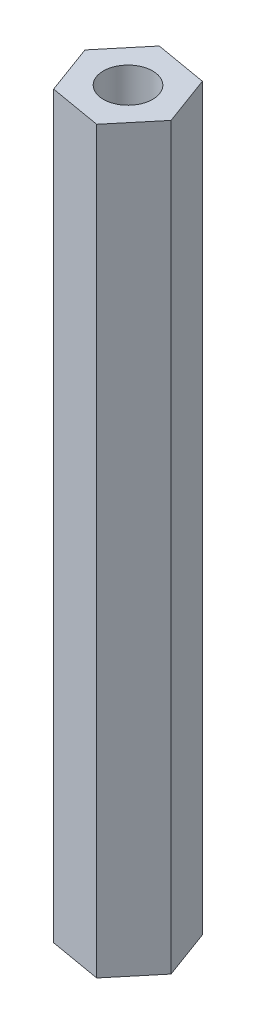
ISO-10303-21;
HEADER;
FILE_DESCRIPTION(('STEP AP214'),'2;1');
FILE_NAME('part.step','',(''),(''),'','','');
FILE_SCHEMA(('AUTOMOTIVE_DESIGN { 1 0 10303 214 1 1 1 1 }'));
ENDSEC;
DATA;
#1=APPLICATION_CONTEXT('core data for automotive mechanical design processes');
#2=APPLICATION_PROTOCOL_DEFINITION('international standard','automotive_design',2000,#1);
#3=PRODUCT_CONTEXT('',#1,'mechanical');
#4=PRODUCT('Part','Part','',(#3));
#5=PRODUCT_RELATED_PRODUCT_CATEGORY('part','',(#4));
#6=PRODUCT_DEFINITION_FORMATION('','',#4);
#7=PRODUCT_DEFINITION_CONTEXT('part definition',#1,'design');
#8=PRODUCT_DEFINITION('design','',#6,#7);
#9=PRODUCT_DEFINITION_SHAPE('','',#8);
#10=(LENGTH_UNIT() NAMED_UNIT(*) SI_UNIT(.MILLI.,.METRE.));
#11=(NAMED_UNIT(*) PLANE_ANGLE_UNIT() SI_UNIT($,.RADIAN.));
#12=(NAMED_UNIT(*) SI_UNIT($,.STERADIAN.) SOLID_ANGLE_UNIT());
#13=UNCERTAINTY_MEASURE_WITH_UNIT(LENGTH_MEASURE(1.E-05),#10,'distance_accuracy_value','');
#14=(GEOMETRIC_REPRESENTATION_CONTEXT(3) GLOBAL_UNCERTAINTY_ASSIGNED_CONTEXT((#13)) GLOBAL_UNIT_ASSIGNED_CONTEXT((#10,
#11,#12)) REPRESENTATION_CONTEXT('',''));
#15=CARTESIAN_POINT('',(0.,0.,0.));
#16=DIRECTION('',(0.,0.,1.));
#17=DIRECTION('',(1.,0.,0.));
#18=AXIS2_PLACEMENT_3D('',#15,#16,#17);
#19=CARTESIAN_POINT('',(0.,45.,0.));
#20=DIRECTION('',(0.,1.,0.));
#21=DIRECTION('',(0.,0.,1.));
#22=AXIS2_PLACEMENT_3D('',#19,#20,#21);
#23=PLANE('',#22);
#24=DIRECTION('',(0.985494120976988,0.,0.169709568144505));
#25=VECTOR('',#24,1.);
#26=CARTESIAN_POINT('',(-2.05624239989983,45.,2.47052622846547));
#27=LINE('',#26,#25);
#28=CARTESIAN_POINT('',(-2.05624239989983,45.,2.47052622846547));
#29=VERTEX_POINT('',#28);
#30=CARTESIAN_POINT('',(1.11141727466937,45.,3.01602126893));
#31=VERTEX_POINT('',#30);
#32=EDGE_CURVE('E146',#29,#31,#27,.T.);
#33=ORIENTED_EDGE('',*,*,#32,.T.);
#34=DIRECTION('',(0.639719857783097,0.,-0.768608159960571));
#35=VECTOR('',#34,1.);
#36=CARTESIAN_POINT('',(1.11141727466937,45.,3.01602126893));
#37=LINE('',#36,#35);
#38=CARTESIAN_POINT('',(3.16765967459966,45.,0.545495040589612));
#39=VERTEX_POINT('',#38);
#40=EDGE_CURVE('E94',#31,#39,#37,.T.);
#41=ORIENTED_EDGE('',*,*,#40,.T.);
#42=DIRECTION('',(-0.345774263225589,0.,-0.938317728112818));
#43=VECTOR('',#42,1.);
#44=CARTESIAN_POINT('',(3.16765967459966,45.,0.545495040589612));
#45=LINE('',#44,#43);
#46=CARTESIAN_POINT('',(2.05624239989944,45.,-2.47052622847075));
#47=VERTEX_POINT('',#46);
#48=EDGE_CURVE('E107',#39,#47,#45,.T.);
#49=ORIENTED_EDGE('',*,*,#48,.T.);
#50=DIRECTION('',(-0.985494120976988,0.,-0.169709568144504));
#51=VECTOR('',#50,1.);
#52=CARTESIAN_POINT('',(2.05624239989944,45.,-2.47052622847075));
#53=LINE('',#52,#51);
#54=CARTESIAN_POINT('',(-1.11141727460843,45.,-3.01602126892472));
#55=VERTEX_POINT('',#54);
#56=EDGE_CURVE('E101',#47,#55,#53,.T.);
#57=ORIENTED_EDGE('',*,*,#56,.T.);
#58=DIRECTION('',(-0.639719857776031,0.,0.768608159966451));
#59=VECTOR('',#58,1.);
#60=CARTESIAN_POINT('',(-1.11141727460843,45.,-3.01602126892472));
#61=LINE('',#60,#59);
#62=CARTESIAN_POINT('',(-3.16765967459978,45.,-0.545495040464771));
#63=VERTEX_POINT('',#62);
#64=EDGE_CURVE('E105',#55,#63,#61,.T.);
#65=ORIENTED_EDGE('',*,*,#64,.T.);
#66=DIRECTION('',(0.345774263238647,0.,0.938317728108007));
#67=VECTOR('',#66,1.);
#68=CARTESIAN_POINT('',(-3.16765967459978,45.,-0.545495040464771));
#69=LINE('',#68,#67);
#70=EDGE_CURVE('E57',#63,#29,#69,.T.);
#71=ORIENTED_EDGE('',*,*,#70,.T.);
#72=EDGE_LOOP('',(#33,#41,#49,#57,#65,#71));
#73=FACE_BOUND('',#72,.T.);
#74=CARTESIAN_POINT('',(-3.16413562017876E-11,45.,-2.37904933848027E-13));
#75=DIRECTION('',(0.,1.,0.));
#76=DIRECTION('',(0.,0.,1.));
#77=AXIS2_PLACEMENT_3D('',#74,#75,#76);
#78=CIRCLE('',#77,1.5);
#79=CARTESIAN_POINT('',(-3.16413562017876E-11,45.,-1.50000000000024));
#80=VERTEX_POINT('',#79);
#81=EDGE_CURVE('E134',#80,#80,#78,.T.);
#82=ORIENTED_EDGE('',*,*,#81,.F.);
#83=EDGE_LOOP('',(#82));
#84=FACE_BOUND('',#83,.T.);
#85=ADVANCED_FACE('F39',(#73,#84),#23,.T.);
#86=CARTESIAN_POINT('',(0.,0.,0.));
#87=DIRECTION('',(0.,1.,0.));
#88=DIRECTION('',(0.,0.,1.));
#89=AXIS2_PLACEMENT_3D('',#86,#87,#88);
#90=PLANE('',#89);
#91=DIRECTION('',(0.985494120976988,0.,0.169709568144505));
#92=VECTOR('',#91,1.);
#93=CARTESIAN_POINT('',(-2.05624239989983,0.,2.47052622846547));
#94=LINE('',#93,#92);
#95=CARTESIAN_POINT('',(-2.05624239989983,0.,2.47052622846547));
#96=VERTEX_POINT('',#95);
#97=CARTESIAN_POINT('',(1.11141727466937,0.,3.01602126893));
#98=VERTEX_POINT('',#97);
#99=EDGE_CURVE('E129',#96,#98,#94,.T.);
#100=ORIENTED_EDGE('',*,*,#99,.F.);
#101=DIRECTION('',(0.345774263238647,0.,0.938317728108007));
#102=VECTOR('',#101,1.);
#103=CARTESIAN_POINT('',(-3.16765967459978,0.,-0.545495040464771));
#104=LINE('',#103,#102);
#105=CARTESIAN_POINT('',(-3.16765967459978,0.,-0.545495040464771));
#106=VERTEX_POINT('',#105);
#107=EDGE_CURVE('E86',#106,#96,#104,.T.);
#108=ORIENTED_EDGE('',*,*,#107,.F.);
#109=DIRECTION('',(-0.639719857776031,0.,0.768608159966451));
#110=VECTOR('',#109,1.);
#111=CARTESIAN_POINT('',(-1.11141727460843,0.,-3.01602126892472));
#112=LINE('',#111,#110);
#113=CARTESIAN_POINT('',(-1.11141727460843,0.,-3.01602126892472));
#114=VERTEX_POINT('',#113);
#115=EDGE_CURVE('E80',#114,#106,#112,.T.);
#116=ORIENTED_EDGE('',*,*,#115,.F.);
#117=DIRECTION('',(-0.985494120976988,0.,-0.169709568144504));
#118=VECTOR('',#117,1.);
#119=CARTESIAN_POINT('',(2.05624239989944,0.,-2.47052622847075));
#120=LINE('',#119,#118);
#121=CARTESIAN_POINT('',(2.05624239989944,0.,-2.47052622847075));
#122=VERTEX_POINT('',#121);
#123=EDGE_CURVE('E116',#122,#114,#120,.T.);
#124=ORIENTED_EDGE('',*,*,#123,.F.);
#125=DIRECTION('',(-0.345774263225589,0.,-0.938317728112818));
#126=VECTOR('',#125,1.);
#127=CARTESIAN_POINT('',(3.16765967459966,0.,0.545495040589612));
#128=LINE('',#127,#126);
#129=CARTESIAN_POINT('',(3.16765967459966,0.,0.545495040589612));
#130=VERTEX_POINT('',#129);
#131=EDGE_CURVE('E137',#130,#122,#128,.T.);
#132=ORIENTED_EDGE('',*,*,#131,.F.);
#133=DIRECTION('',(0.639719857783097,0.,-0.768608159960571));
#134=VECTOR('',#133,1.);
#135=CARTESIAN_POINT('',(1.11141727466937,0.,3.01602126893));
#136=LINE('',#135,#134);
#137=EDGE_CURVE('E133',#98,#130,#136,.T.);
#138=ORIENTED_EDGE('',*,*,#137,.F.);
#139=EDGE_LOOP('',(#100,#108,#116,#124,#132,#138));
#140=FACE_BOUND('',#139,.T.);
#141=CARTESIAN_POINT('',(-3.16413562017876E-11,0.,-2.37904933848027E-13));
#142=DIRECTION('',(0.,1.,0.));
#143=DIRECTION('',(0.,0.,1.));
#144=AXIS2_PLACEMENT_3D('',#141,#142,#143);
#145=CIRCLE('',#144,1.5);
#146=CARTESIAN_POINT('',(-3.16413562017876E-11,0.,-1.50000000000024));
#147=VERTEX_POINT('',#146);
#148=EDGE_CURVE('E243',#147,#147,#145,.T.);
#149=ORIENTED_EDGE('',*,*,#148,.T.);
#150=EDGE_LOOP('',(#149));
#151=FACE_BOUND('',#150,.T.);
#152=ADVANCED_FACE('F159',(#140,#151),#90,.F.);
#153=CARTESIAN_POINT('',(-2.05624239989983,45.,2.47052622846547));
#154=DIRECTION('',(0.169709568144505,0.,-0.985494120976988));
#155=DIRECTION('',(-0.985494120976988,0.,-0.169709568144505));
#156=AXIS2_PLACEMENT_3D('',#153,#154,#155);
#157=PLANE('',#156);
#158=ORIENTED_EDGE('',*,*,#99,.T.);
#159=DIRECTION('',(0.,-1.,0.));
#160=VECTOR('',#159,1.);
#161=CARTESIAN_POINT('',(1.11141727466937,45.,3.01602126893));
#162=LINE('',#161,#160);
#163=EDGE_CURVE('E11',#31,#98,#162,.T.);
#164=ORIENTED_EDGE('',*,*,#163,.F.);
#165=ORIENTED_EDGE('',*,*,#32,.F.);
#166=DIRECTION('',(0.,-1.,0.));
#167=VECTOR('',#166,1.);
#168=CARTESIAN_POINT('',(-2.05624239989983,45.,2.47052622846547));
#169=LINE('',#168,#167);
#170=EDGE_CURVE('E125',#29,#96,#169,.T.);
#171=ORIENTED_EDGE('',*,*,#170,.T.);
#172=EDGE_LOOP('',(#158,#164,#165,#171));
#173=FACE_BOUND('',#172,.T.);
#174=ADVANCED_FACE('F41',(#173),#157,.F.);
#175=CARTESIAN_POINT('',(1.11141727466937,45.,3.01602126893));
#176=DIRECTION('',(-0.768608159960571,0.,-0.639719857783097));
#177=DIRECTION('',(-0.639719857783097,0.,0.768608159960571));
#178=AXIS2_PLACEMENT_3D('',#175,#176,#177);
#179=PLANE('',#178);
#180=ORIENTED_EDGE('',*,*,#137,.T.);
#181=DIRECTION('',(0.,-1.,0.));
#182=VECTOR('',#181,1.);
#183=CARTESIAN_POINT('',(3.16765967459966,45.,0.545495040589612));
#184=LINE('',#183,#182);
#185=EDGE_CURVE('E49',#39,#130,#184,.T.);
#186=ORIENTED_EDGE('',*,*,#185,.F.);
#187=ORIENTED_EDGE('',*,*,#40,.F.);
#188=ORIENTED_EDGE('',*,*,#163,.T.);
#189=EDGE_LOOP('',(#180,#186,#187,#188));
#190=FACE_BOUND('',#189,.T.);
#191=ADVANCED_FACE('F184',(#190),#179,.F.);
#192=CARTESIAN_POINT('',(3.16765967459966,45.,0.545495040589612));
#193=DIRECTION('',(-0.938317728112818,0.,0.345774263225589));
#194=DIRECTION('',(0.345774263225589,0.,0.938317728112819));
#195=AXIS2_PLACEMENT_3D('',#192,#193,#194);
#196=PLANE('',#195);
#197=ORIENTED_EDGE('',*,*,#131,.T.);
#198=DIRECTION('',(0.,-1.,0.));
#199=VECTOR('',#198,1.);
#200=CARTESIAN_POINT('',(2.05624239989944,45.,-2.47052622847075));
#201=LINE('',#200,#199);
#202=EDGE_CURVE('E118',#47,#122,#201,.T.);
#203=ORIENTED_EDGE('',*,*,#202,.F.);
#204=ORIENTED_EDGE('',*,*,#48,.F.);
#205=ORIENTED_EDGE('',*,*,#185,.T.);
#206=EDGE_LOOP('',(#197,#203,#204,#205));
#207=FACE_BOUND('',#206,.T.);
#208=ADVANCED_FACE('F156',(#207),#196,.F.);
#209=CARTESIAN_POINT('',(2.05624239989944,45.,-2.47052622847075));
#210=DIRECTION('',(-0.169709568144504,0.,0.985494120976988));
#211=DIRECTION('',(0.985494120976988,0.,0.169709568144504));
#212=AXIS2_PLACEMENT_3D('',#209,#210,#211);
#213=PLANE('',#212);
#214=ORIENTED_EDGE('',*,*,#123,.T.);
#215=DIRECTION('',(0.,-1.,0.));
#216=VECTOR('',#215,1.);
#217=CARTESIAN_POINT('',(-1.11141727460843,45.,-3.01602126892472));
#218=LINE('',#217,#216);
#219=EDGE_CURVE('E113',#55,#114,#218,.T.);
#220=ORIENTED_EDGE('',*,*,#219,.F.);
#221=ORIENTED_EDGE('',*,*,#56,.F.);
#222=ORIENTED_EDGE('',*,*,#202,.T.);
#223=EDGE_LOOP('',(#214,#220,#221,#222));
#224=FACE_BOUND('',#223,.T.);
#225=ADVANCED_FACE('F114',(#224),#213,.F.);
#226=CARTESIAN_POINT('',(-1.11141727460843,45.,-3.01602126892472));
#227=DIRECTION('',(0.768608159966451,0.,0.639719857776031));
#228=DIRECTION('',(0.639719857776031,0.,-0.768608159966452));
#229=AXIS2_PLACEMENT_3D('',#226,#227,#228);
#230=PLANE('',#229);
#231=ORIENTED_EDGE('',*,*,#115,.T.);
#232=DIRECTION('',(0.,-1.,0.));
#233=VECTOR('',#232,1.);
#234=CARTESIAN_POINT('',(-3.16765967459978,45.,-0.545495040464771));
#235=LINE('',#234,#233);
#236=EDGE_CURVE('E119',#63,#106,#235,.T.);
#237=ORIENTED_EDGE('',*,*,#236,.F.);
#238=ORIENTED_EDGE('',*,*,#64,.F.);
#239=ORIENTED_EDGE('',*,*,#219,.T.);
#240=EDGE_LOOP('',(#231,#237,#238,#239));
#241=FACE_BOUND('',#240,.T.);
#242=ADVANCED_FACE('F121',(#241),#230,.F.);
#243=CARTESIAN_POINT('',(-3.16765967459978,45.,-0.545495040464771));
#244=DIRECTION('',(0.938317728108007,0.,-0.345774263238647));
#245=DIRECTION('',(-0.345774263238647,0.,-0.938317728108007));
#246=AXIS2_PLACEMENT_3D('',#243,#244,#245);
#247=PLANE('',#246);
#248=ORIENTED_EDGE('',*,*,#107,.T.);
#249=ORIENTED_EDGE('',*,*,#170,.F.);
#250=ORIENTED_EDGE('',*,*,#70,.F.);
#251=ORIENTED_EDGE('',*,*,#236,.T.);
#252=EDGE_LOOP('',(#248,#249,#250,#251));
#253=FACE_BOUND('',#252,.T.);
#254=ADVANCED_FACE('F164',(#253),#247,.F.);
#255=CARTESIAN_POINT('',(-3.16413562017876E-11,45.,-2.37904933848027E-13));
#256=DIRECTION('',(0.,-1.,0.));
#257=DIRECTION('',(0.,0.,-1.));
#258=AXIS2_PLACEMENT_3D('',#255,#256,#257);
#259=CYLINDRICAL_SURFACE('',#258,1.5);
#260=CARTESIAN_POINT('',(-3.16413562017876E-11,45.,-1.50000000000024));
#261=CARTESIAN_POINT('',(-3.16413562017876E-11,44.53125,-1.50000000000024));
#262=CARTESIAN_POINT('',(-3.16413562017876E-11,44.0625,-1.50000000000024));
#263=CARTESIAN_POINT('',(-3.16413562017876E-11,43.125,-1.50000000000024));
#264=CARTESIAN_POINT('',(-3.16413562017876E-11,42.65625,-1.50000000000024));
#265=CARTESIAN_POINT('',(-3.16413562017876E-11,41.71875,-1.50000000000024));
#266=CARTESIAN_POINT('',(-3.16413562017876E-11,41.25,-1.50000000000024));
#267=CARTESIAN_POINT('',(-3.16413562017876E-11,40.3125,-1.50000000000024));
#268=CARTESIAN_POINT('',(-3.16413562017876E-11,39.84375,-1.50000000000024));
#269=CARTESIAN_POINT('',(-3.16413562017876E-11,38.90625,-1.50000000000024));
#270=CARTESIAN_POINT('',(-3.16413562017876E-11,38.4375,-1.50000000000024));
#271=CARTESIAN_POINT('',(-3.16413562017876E-11,37.5,-1.50000000000024));
#272=CARTESIAN_POINT('',(-3.16413562017876E-11,37.03125,-1.50000000000024));
#273=CARTESIAN_POINT('',(-3.16413562017876E-11,36.09375,-1.50000000000024));
#274=CARTESIAN_POINT('',(-3.16413562017876E-11,35.625,-1.50000000000024));
#275=CARTESIAN_POINT('',(-3.16413562017876E-11,34.6875,-1.50000000000024));
#276=CARTESIAN_POINT('',(-3.16413562017876E-11,34.21875,-1.50000000000024));
#277=CARTESIAN_POINT('',(-3.16413562017876E-11,33.28125,-1.50000000000024));
#278=CARTESIAN_POINT('',(-3.16413562017876E-11,32.8125,-1.50000000000024));
#279=CARTESIAN_POINT('',(-3.16413562017876E-11,31.875,-1.50000000000024));
#280=CARTESIAN_POINT('',(-3.16413562017876E-11,31.40625,-1.50000000000024));
#281=CARTESIAN_POINT('',(-3.16413562017876E-11,30.46875,-1.50000000000024));
#282=CARTESIAN_POINT('',(-3.16413562017876E-11,30.,-1.50000000000024));
#283=CARTESIAN_POINT('',(-3.16413562017876E-11,29.0625,-1.50000000000024));
#284=CARTESIAN_POINT('',(-3.16413562017876E-11,28.59375,-1.50000000000024));
#285=CARTESIAN_POINT('',(-3.16413562017876E-11,27.65625,-1.50000000000024));
#286=CARTESIAN_POINT('',(-3.16413562017876E-11,27.1875,-1.50000000000024));
#287=CARTESIAN_POINT('',(-3.16413562017876E-11,26.25,-1.50000000000024));
#288=CARTESIAN_POINT('',(-3.16413562017876E-11,25.78125,-1.50000000000024));
#289=CARTESIAN_POINT('',(-3.16413562017876E-11,24.84375,-1.50000000000024));
#290=CARTESIAN_POINT('',(-3.16413562017876E-11,24.375,-1.50000000000024));
#291=CARTESIAN_POINT('',(-3.16413562017876E-11,23.4375,-1.50000000000024));
#292=CARTESIAN_POINT('',(-3.16413562017876E-11,22.96875,-1.50000000000024));
#293=CARTESIAN_POINT('',(-3.16413562017876E-11,22.03125,-1.50000000000024));
#294=CARTESIAN_POINT('',(-3.16413562017876E-11,21.5625,-1.50000000000024));
#295=CARTESIAN_POINT('',(-3.16413562017876E-11,20.625,-1.50000000000024));
#296=CARTESIAN_POINT('',(-3.16413562017876E-11,20.15625,-1.50000000000024));
#297=CARTESIAN_POINT('',(-3.16413562017876E-11,19.21875,-1.50000000000024));
#298=CARTESIAN_POINT('',(-3.16413562017876E-11,18.75,-1.50000000000024));
#299=CARTESIAN_POINT('',(-3.16413562017876E-11,17.8125,-1.50000000000024));
#300=CARTESIAN_POINT('',(-3.16413562017876E-11,17.34375,-1.50000000000024));
#301=CARTESIAN_POINT('',(-3.16413562017876E-11,16.40625,-1.50000000000024));
#302=CARTESIAN_POINT('',(-3.16413562017876E-11,15.9375,-1.50000000000024));
#303=CARTESIAN_POINT('',(-3.16413562017876E-11,15.,-1.50000000000024));
#304=CARTESIAN_POINT('',(-3.16413562017876E-11,14.53125,-1.50000000000024));
#305=CARTESIAN_POINT('',(-3.16413562017876E-11,13.59375,-1.50000000000024));
#306=CARTESIAN_POINT('',(-3.16413562017876E-11,13.125,-1.50000000000024));
#307=CARTESIAN_POINT('',(-3.16413562017876E-11,12.1875,-1.50000000000024));
#308=CARTESIAN_POINT('',(-3.16413562017876E-11,11.71875,-1.50000000000024));
#309=CARTESIAN_POINT('',(-3.16413562017876E-11,10.78125,-1.50000000000024));
#310=CARTESIAN_POINT('',(-3.16413562017876E-11,10.3125,-1.50000000000024));
#311=CARTESIAN_POINT('',(-3.16413562017876E-11,9.37499999999999,-1.50000000000024));
#312=CARTESIAN_POINT('',(-3.16413562017876E-11,8.90624999999999,-1.50000000000024));
#313=CARTESIAN_POINT('',(-3.16413562017876E-11,7.96874999999999,-1.50000000000024));
#314=CARTESIAN_POINT('',(-3.16413562017876E-11,7.5,-1.50000000000024));
#315=CARTESIAN_POINT('',(-3.16413562017876E-11,6.56249999999999,-1.50000000000024));
#316=CARTESIAN_POINT('',(-3.16413562017876E-11,6.09374999999999,-1.50000000000024));
#317=CARTESIAN_POINT('',(-3.16413562017876E-11,5.15624999999999,-1.50000000000024));
#318=CARTESIAN_POINT('',(-3.16413562017876E-11,4.68749999999999,-1.50000000000024));
#319=CARTESIAN_POINT('',(-3.16413562017876E-11,3.74999999999999,-1.50000000000024));
#320=CARTESIAN_POINT('',(-3.16413562017876E-11,3.28124999999999,-1.50000000000024));
#321=CARTESIAN_POINT('',(-3.16413562017876E-11,2.34374999999999,-1.50000000000024));
#322=CARTESIAN_POINT('',(-3.16413562017876E-11,1.87499999999999,-1.50000000000024));
#323=CARTESIAN_POINT('',(-3.16413562017876E-11,0.937499999999992,-1.50000000000024));
#324=CARTESIAN_POINT('',(-3.16413562017876E-11,0.468749999999993,-1.50000000000024));
#325=CARTESIAN_POINT('',(-3.16413562017876E-11,0.,-1.50000000000024));
#326=B_SPLINE_CURVE_WITH_KNOTS('',3,(#260,#261,#262,#263,#264,#265,#266,#267,#268,#269,#270,
#271,#272,#273,#274,#275,#276,#277,#278,#279,#280,#281,#282,#283,#284,#285,#286,#287,#288,#289,
#290,#291,#292,#293,#294,#295,#296,#297,#298,#299,#300,#301,#302,#303,#304,#305,#306,#307,#308,
#309,#310,#311,#312,#313,#314,#315,#316,#317,#318,#319,#320,#321,#322,#323,#324,#325),
.UNSPECIFIED.,.F.,.F.,(4,2,2,2,2,2,2,2,2,2,2,2,2,2,2,2,2,2,2,2,2,2,2,2,2,2,2,2,2,2,2,2,4),(0.,
1.40625,2.8125,4.21874999999999,5.625,7.03125,8.43749999999999,9.84375,11.25,12.65625,14.0625,
15.46875,16.875,18.28125,19.6875,21.09375,22.5,23.90625,25.3125,26.71875,28.125,29.53125,
30.9375,32.34375,33.75,35.15625,36.5625,37.96875,39.375,40.78125,42.1875,43.59375,45.),.UNSPECIFIED.);
#327=EDGE_CURVE('BSEAM166',#80,#147,#326,.T.);
#328=ORIENTED_EDGE('',*,*,#81,.T.);
#329=ORIENTED_EDGE('',*,*,#148,.F.);
#330=ORIENTED_EDGE('',*,*,#327,.T.);
#331=ORIENTED_EDGE('',*,*,#327,.F.);
#332=EDGE_LOOP('',(#328,#330,#329,#331));
#333=FACE_BOUND('',#332,.T.);
#334=ADVANCED_FACE('F166',(#333),#259,.F.);
#335=CLOSED_SHELL('',(#85,#152,#174,#191,#208,#225,#242,#254,#334));
#336=MANIFOLD_SOLID_BREP('B2',#335);
#337=ADVANCED_BREP_SHAPE_REPRESENTATION('',(#18,#336),#14);
#338=SHAPE_DEFINITION_REPRESENTATION(#9,#337);
ENDSEC;
END-ISO-10303-21;
